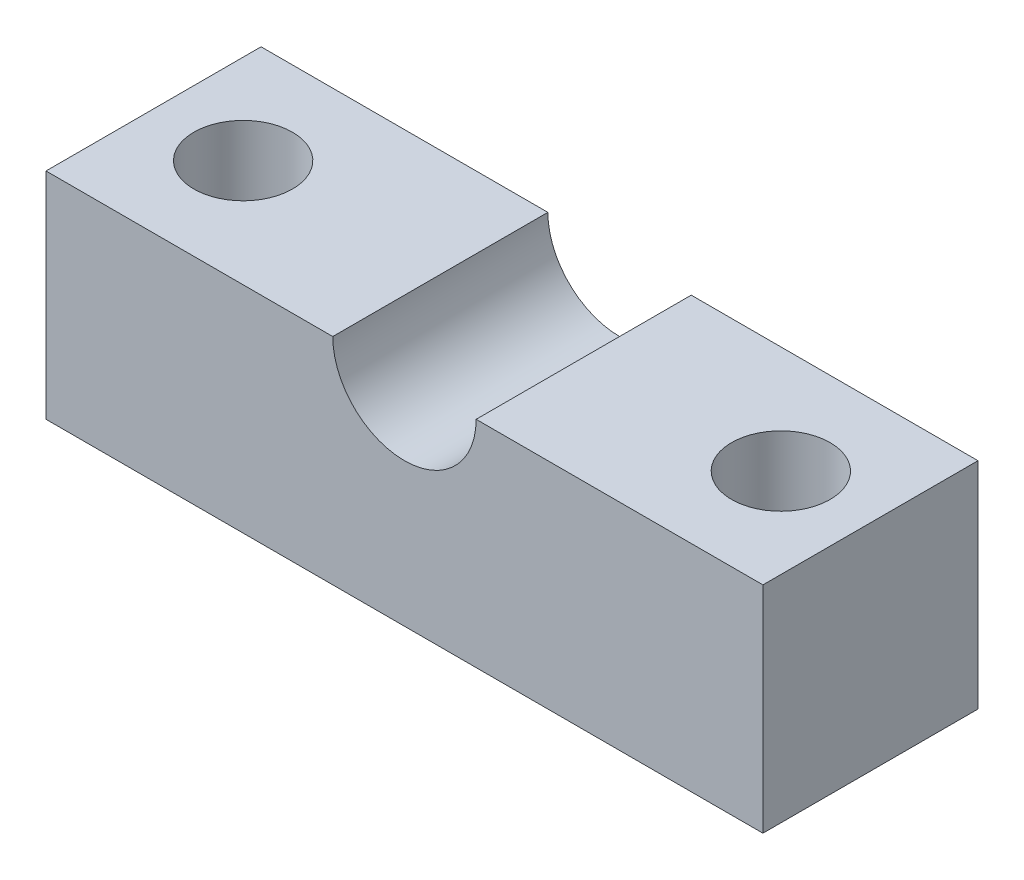
ISO-10303-21;
HEADER;
FILE_DESCRIPTION(('STEP AP214'),'2;1');
FILE_NAME('part.step','',(''),(''),'','','');
FILE_SCHEMA(('AUTOMOTIVE_DESIGN { 1 0 10303 214 1 1 1 1 }'));
ENDSEC;
DATA;
#1=APPLICATION_CONTEXT('core data for automotive mechanical design processes');
#2=APPLICATION_PROTOCOL_DEFINITION('international standard','automotive_design',2000,#1);
#3=PRODUCT_CONTEXT('',#1,'mechanical');
#4=PRODUCT('Part','Part','',(#3));
#5=PRODUCT_RELATED_PRODUCT_CATEGORY('part','',(#4));
#6=PRODUCT_DEFINITION_FORMATION('','',#4);
#7=PRODUCT_DEFINITION_CONTEXT('part definition',#1,'design');
#8=PRODUCT_DEFINITION('design','',#6,#7);
#9=PRODUCT_DEFINITION_SHAPE('','',#8);
#10=(LENGTH_UNIT() NAMED_UNIT(*) SI_UNIT(.MILLI.,.METRE.));
#11=(NAMED_UNIT(*) PLANE_ANGLE_UNIT() SI_UNIT($,.RADIAN.));
#12=(NAMED_UNIT(*) SI_UNIT($,.STERADIAN.) SOLID_ANGLE_UNIT());
#13=UNCERTAINTY_MEASURE_WITH_UNIT(LENGTH_MEASURE(1.E-05),#10,'distance_accuracy_value','');
#14=(GEOMETRIC_REPRESENTATION_CONTEXT(3) GLOBAL_UNCERTAINTY_ASSIGNED_CONTEXT((#13)) GLOBAL_UNIT_ASSIGNED_CONTEXT((#10,
#11,#12)) REPRESENTATION_CONTEXT('',''));
#15=CARTESIAN_POINT('',(0.,0.,0.));
#16=DIRECTION('',(0.,0.,1.));
#17=DIRECTION('',(1.,0.,0.));
#18=AXIS2_PLACEMENT_3D('',#15,#16,#17);
#19=CARTESIAN_POINT('',(0.,0.,12.));
#20=DIRECTION('',(1.,0.,0.));
#21=DIRECTION('',(0.,0.,-1.));
#22=AXIS2_PLACEMENT_3D('',#19,#20,#21);
#23=PLANE('',#22);
#24=DIRECTION('',(0.,-1.,0.));
#25=VECTOR('',#24,1.);
#26=CARTESIAN_POINT('',(0.,0.,0.));
#27=LINE('',#26,#25);
#28=CARTESIAN_POINT('',(0.,12.,0.));
#29=VERTEX_POINT('',#28);
#30=CARTESIAN_POINT('',(0.,0.,0.));
#31=VERTEX_POINT('',#30);
#32=EDGE_CURVE('E128',#29,#31,#27,.T.);
#33=ORIENTED_EDGE('',*,*,#32,.T.);
#34=DIRECTION('',(0.,0.,-1.));
#35=VECTOR('',#34,1.);
#36=CARTESIAN_POINT('',(0.,0.,12.));
#37=LINE('',#36,#35);
#38=CARTESIAN_POINT('',(0.,0.,12.));
#39=VERTEX_POINT('',#38);
#40=EDGE_CURVE('E11',#39,#31,#37,.T.);
#41=ORIENTED_EDGE('',*,*,#40,.F.);
#42=DIRECTION('',(0.,-1.,0.));
#43=VECTOR('',#42,1.);
#44=CARTESIAN_POINT('',(0.,0.,12.));
#45=LINE('',#44,#43);
#46=CARTESIAN_POINT('',(0.,12.,12.));
#47=VERTEX_POINT('',#46);
#48=EDGE_CURVE('E145',#47,#39,#45,.T.);
#49=ORIENTED_EDGE('',*,*,#48,.F.);
#50=DIRECTION('',(0.,0.,-1.));
#51=VECTOR('',#50,1.);
#52=CARTESIAN_POINT('',(0.,12.,12.));
#53=LINE('',#52,#51);
#54=EDGE_CURVE('E124',#47,#29,#53,.T.);
#55=ORIENTED_EDGE('',*,*,#54,.T.);
#56=EDGE_LOOP('',(#33,#41,#49,#55));
#57=FACE_BOUND('',#56,.T.);
#58=ADVANCED_FACE('F39',(#57),#23,.F.);
#59=CARTESIAN_POINT('',(0.,0.,12.));
#60=DIRECTION('',(0.,1.,0.));
#61=DIRECTION('',(0.,0.,1.));
#62=AXIS2_PLACEMENT_3D('',#59,#60,#61);
#63=PLANE('',#62);
#64=CARTESIAN_POINT('',(5.,0.,6.));
#65=DIRECTION('',(0.,-1.,0.));
#66=DIRECTION('',(0.,0.,-1.));
#67=AXIS2_PLACEMENT_3D('',#64,#65,#66);
#68=CIRCLE('',#67,2.74999999999999);
#69=CARTESIAN_POINT('',(5.,0.,3.25000000000001));
#70=VERTEX_POINT('',#69);
#71=EDGE_CURVE('E209',#70,#70,#68,.T.);
#72=ORIENTED_EDGE('',*,*,#71,.F.);
#73=EDGE_LOOP('',(#72));
#74=FACE_BOUND('',#73,.T.);
#75=CARTESIAN_POINT('',(35.,0.,6.));
#76=DIRECTION('',(0.,-1.,0.));
#77=DIRECTION('',(0.,0.,-1.));
#78=AXIS2_PLACEMENT_3D('',#75,#76,#77);
#79=CIRCLE('',#78,2.74999999999999);
#80=CARTESIAN_POINT('',(35.,0.,3.25000000000001));
#81=VERTEX_POINT('',#80);
#82=EDGE_CURVE('E195',#81,#81,#79,.T.);
#83=ORIENTED_EDGE('',*,*,#82,.F.);
#84=EDGE_LOOP('',(#83));
#85=FACE_BOUND('',#84,.T.);
#86=DIRECTION('',(1.,0.,0.));
#87=VECTOR('',#86,1.);
#88=CARTESIAN_POINT('',(0.,0.,0.));
#89=LINE('',#88,#87);
#90=CARTESIAN_POINT('',(40.,0.,0.));
#91=VERTEX_POINT('',#90);
#92=EDGE_CURVE('E132',#31,#91,#89,.T.);
#93=ORIENTED_EDGE('',*,*,#92,.T.);
#94=DIRECTION('',(0.,0.,-1.));
#95=VECTOR('',#94,1.);
#96=CARTESIAN_POINT('',(40.,0.,12.));
#97=LINE('',#96,#95);
#98=CARTESIAN_POINT('',(40.,0.,12.));
#99=VERTEX_POINT('',#98);
#100=EDGE_CURVE('E48',#99,#91,#97,.T.);
#101=ORIENTED_EDGE('',*,*,#100,.F.);
#102=DIRECTION('',(1.,0.,0.));
#103=VECTOR('',#102,1.);
#104=CARTESIAN_POINT('',(0.,0.,12.));
#105=LINE('',#104,#103);
#106=EDGE_CURVE('E93',#39,#99,#105,.T.);
#107=ORIENTED_EDGE('',*,*,#106,.F.);
#108=ORIENTED_EDGE('',*,*,#40,.T.);
#109=EDGE_LOOP('',(#93,#101,#107,#108));
#110=FACE_BOUND('',#109,.T.);
#111=ADVANCED_FACE('F175',(#74,#85,#110),#63,.F.);
#112=CARTESIAN_POINT('',(40.,0.,12.));
#113=DIRECTION('',(-1.,0.,0.));
#114=DIRECTION('',(0.,0.,1.));
#115=AXIS2_PLACEMENT_3D('',#112,#113,#114);
#116=PLANE('',#115);
#117=DIRECTION('',(0.,1.,0.));
#118=VECTOR('',#117,1.);
#119=CARTESIAN_POINT('',(40.,0.,0.));
#120=LINE('',#119,#118);
#121=CARTESIAN_POINT('',(40.,12.,0.));
#122=VERTEX_POINT('',#121);
#123=EDGE_CURVE('E136',#91,#122,#120,.T.);
#124=ORIENTED_EDGE('',*,*,#123,.T.);
#125=DIRECTION('',(0.,0.,-1.));
#126=VECTOR('',#125,1.);
#127=CARTESIAN_POINT('',(40.,12.,12.));
#128=LINE('',#127,#126);
#129=CARTESIAN_POINT('',(40.,12.,12.));
#130=VERTEX_POINT('',#129);
#131=EDGE_CURVE('E117',#130,#122,#128,.T.);
#132=ORIENTED_EDGE('',*,*,#131,.F.);
#133=DIRECTION('',(0.,1.,0.));
#134=VECTOR('',#133,1.);
#135=CARTESIAN_POINT('',(40.,0.,12.));
#136=LINE('',#135,#134);
#137=EDGE_CURVE('E106',#99,#130,#136,.T.);
#138=ORIENTED_EDGE('',*,*,#137,.F.);
#139=ORIENTED_EDGE('',*,*,#100,.T.);
#140=EDGE_LOOP('',(#124,#132,#138,#139));
#141=FACE_BOUND('',#140,.T.);
#142=ADVANCED_FACE('F155',(#141),#116,.F.);
#143=CARTESIAN_POINT('',(24.,12.,12.));
#144=DIRECTION('',(0.,-1.,0.));
#145=DIRECTION('',(0.,0.,-1.));
#146=AXIS2_PLACEMENT_3D('',#143,#144,#145);
#147=PLANE('',#146);
#148=CARTESIAN_POINT('',(35.,12.,6.));
#149=DIRECTION('',(0.,-1.,0.));
#150=DIRECTION('',(0.,0.,-1.));
#151=AXIS2_PLACEMENT_3D('',#148,#149,#150);
#152=CIRCLE('',#151,2.75);
#153=CARTESIAN_POINT('',(35.,12.,3.25));
#154=VERTEX_POINT('',#153);
#155=EDGE_CURVE('E133',#154,#154,#152,.T.);
#156=ORIENTED_EDGE('',*,*,#155,.T.);
#157=EDGE_LOOP('',(#156));
#158=FACE_BOUND('',#157,.T.);
#159=DIRECTION('',(-1.,0.,0.));
#160=VECTOR('',#159,1.);
#161=CARTESIAN_POINT('',(24.,12.,0.));
#162=LINE('',#161,#160);
#163=CARTESIAN_POINT('',(24.,12.,0.));
#164=VERTEX_POINT('',#163);
#165=EDGE_CURVE('E115',#122,#164,#162,.T.);
#166=ORIENTED_EDGE('',*,*,#165,.T.);
#167=DIRECTION('',(0.,0.,-1.));
#168=VECTOR('',#167,1.);
#169=CARTESIAN_POINT('',(24.,12.,12.));
#170=LINE('',#169,#168);
#171=CARTESIAN_POINT('',(24.,12.,12.));
#172=VERTEX_POINT('',#171);
#173=EDGE_CURVE('E112',#172,#164,#170,.T.);
#174=ORIENTED_EDGE('',*,*,#173,.F.);
#175=DIRECTION('',(-1.,0.,0.));
#176=VECTOR('',#175,1.);
#177=CARTESIAN_POINT('',(24.,12.,12.));
#178=LINE('',#177,#176);
#179=EDGE_CURVE('E100',#130,#172,#178,.T.);
#180=ORIENTED_EDGE('',*,*,#179,.F.);
#181=ORIENTED_EDGE('',*,*,#131,.T.);
#182=EDGE_LOOP('',(#166,#174,#180,#181));
#183=FACE_BOUND('',#182,.T.);
#184=ADVANCED_FACE('F113',(#158,#183),#147,.F.);
#185=CARTESIAN_POINT('',(20.,12.,12.));
#186=DIRECTION('',(0.,0.,-1.));
#187=DIRECTION('',(-1.,0.,0.));
#188=AXIS2_PLACEMENT_3D('',#185,#186,#187);
#189=CYLINDRICAL_SURFACE('',#188,4.);
#190=CARTESIAN_POINT('',(20.,12.,0.));
#191=DIRECTION('',(0.,0.,-1.));
#192=DIRECTION('',(1.,0.,0.));
#193=AXIS2_PLACEMENT_3D('',#190,#191,#192);
#194=CIRCLE('',#193,4.);
#195=CARTESIAN_POINT('',(16.,12.,0.));
#196=VERTEX_POINT('',#195);
#197=EDGE_CURVE('E79',#164,#196,#194,.T.);
#198=ORIENTED_EDGE('',*,*,#197,.T.);
#199=DIRECTION('',(0.,0.,-1.));
#200=VECTOR('',#199,1.);
#201=CARTESIAN_POINT('',(16.,12.,12.));
#202=LINE('',#201,#200);
#203=CARTESIAN_POINT('',(16.,12.,12.));
#204=VERTEX_POINT('',#203);
#205=EDGE_CURVE('E118',#204,#196,#202,.T.);
#206=ORIENTED_EDGE('',*,*,#205,.F.);
#207=CARTESIAN_POINT('',(20.,12.,12.));
#208=DIRECTION('',(0.,0.,-1.));
#209=DIRECTION('',(1.,0.,0.));
#210=AXIS2_PLACEMENT_3D('',#207,#208,#209);
#211=CIRCLE('',#210,4.);
#212=EDGE_CURVE('E104',#172,#204,#211,.T.);
#213=ORIENTED_EDGE('',*,*,#212,.F.);
#214=ORIENTED_EDGE('',*,*,#173,.T.);
#215=EDGE_LOOP('',(#198,#206,#213,#214));
#216=FACE_BOUND('',#215,.T.);
#217=ADVANCED_FACE('F120',(#216),#189,.F.);
#218=CARTESIAN_POINT('',(0.,12.,12.));
#219=DIRECTION('',(0.,-1.,0.));
#220=DIRECTION('',(0.,0.,-1.));
#221=AXIS2_PLACEMENT_3D('',#218,#219,#220);
#222=PLANE('',#221);
#223=CARTESIAN_POINT('',(5.,12.,6.));
#224=DIRECTION('',(0.,-1.,0.));
#225=DIRECTION('',(0.,0.,-1.));
#226=AXIS2_PLACEMENT_3D('',#223,#224,#225);
#227=CIRCLE('',#226,2.75);
#228=CARTESIAN_POINT('',(5.,12.,3.25));
#229=VERTEX_POINT('',#228);
#230=EDGE_CURVE('E199',#229,#229,#227,.T.);
#231=ORIENTED_EDGE('',*,*,#230,.T.);
#232=EDGE_LOOP('',(#231));
#233=FACE_BOUND('',#232,.T.);
#234=DIRECTION('',(-1.,0.,0.));
#235=VECTOR('',#234,1.);
#236=CARTESIAN_POINT('',(0.,12.,0.));
#237=LINE('',#236,#235);
#238=EDGE_CURVE('E85',#196,#29,#237,.T.);
#239=ORIENTED_EDGE('',*,*,#238,.T.);
#240=ORIENTED_EDGE('',*,*,#54,.F.);
#241=DIRECTION('',(-1.,0.,0.));
#242=VECTOR('',#241,1.);
#243=CARTESIAN_POINT('',(0.,12.,12.));
#244=LINE('',#243,#242);
#245=EDGE_CURVE('E56',#204,#47,#244,.T.);
#246=ORIENTED_EDGE('',*,*,#245,.F.);
#247=ORIENTED_EDGE('',*,*,#205,.T.);
#248=EDGE_LOOP('',(#239,#240,#246,#247));
#249=FACE_BOUND('',#248,.T.);
#250=ADVANCED_FACE('F162',(#233,#249),#222,.F.);
#251=CARTESIAN_POINT('',(20.,12.,12.));
#252=DIRECTION('',(0.,0.,1.));
#253=DIRECTION('',(1.,0.,0.));
#254=AXIS2_PLACEMENT_3D('',#251,#252,#253);
#255=PLANE('',#254);
#256=ORIENTED_EDGE('',*,*,#48,.T.);
#257=ORIENTED_EDGE('',*,*,#106,.T.);
#258=ORIENTED_EDGE('',*,*,#137,.T.);
#259=ORIENTED_EDGE('',*,*,#179,.T.);
#260=ORIENTED_EDGE('',*,*,#212,.T.);
#261=ORIENTED_EDGE('',*,*,#245,.T.);
#262=EDGE_LOOP('',(#256,#257,#258,#259,#260,#261));
#263=FACE_BOUND('',#262,.T.);
#264=ADVANCED_FACE('F102',(#263),#255,.T.);
#265=CARTESIAN_POINT('',(20.,12.,0.));
#266=DIRECTION('',(0.,0.,1.));
#267=DIRECTION('',(1.,0.,0.));
#268=AXIS2_PLACEMENT_3D('',#265,#266,#267);
#269=PLANE('',#268);
#270=ORIENTED_EDGE('',*,*,#32,.F.);
#271=ORIENTED_EDGE('',*,*,#238,.F.);
#272=ORIENTED_EDGE('',*,*,#197,.F.);
#273=ORIENTED_EDGE('',*,*,#165,.F.);
#274=ORIENTED_EDGE('',*,*,#123,.F.);
#275=ORIENTED_EDGE('',*,*,#92,.F.);
#276=EDGE_LOOP('',(#270,#271,#272,#273,#274,#275));
#277=FACE_BOUND('',#276,.T.);
#278=ADVANCED_FACE('F158',(#277),#269,.F.);
#279=CARTESIAN_POINT('',(35.,0.,6.));
#280=DIRECTION('',(0.,-1.,0.));
#281=DIRECTION('',(0.,0.,-1.));
#282=AXIS2_PLACEMENT_3D('',#279,#280,#281);
#283=CYLINDRICAL_SURFACE('',#282,2.74999999999999);
#284=ORIENTED_EDGE('',*,*,#155,.F.);
#285=EDGE_LOOP('',(#284));
#286=FACE_BOUND('',#285,.T.);
#287=ORIENTED_EDGE('',*,*,#82,.T.);
#288=EDGE_LOOP('',(#287));
#289=FACE_BOUND('',#288,.T.);
#290=ADVANCED_FACE('F215',(#286,#289),#283,.F.);
#291=CARTESIAN_POINT('',(5.,0.,6.));
#292=DIRECTION('',(0.,-1.,0.));
#293=DIRECTION('',(0.,0.,-1.));
#294=AXIS2_PLACEMENT_3D('',#291,#292,#293);
#295=CYLINDRICAL_SURFACE('',#294,2.74999999999999);
#296=ORIENTED_EDGE('',*,*,#230,.F.);
#297=EDGE_LOOP('',(#296));
#298=FACE_BOUND('',#297,.T.);
#299=ORIENTED_EDGE('',*,*,#71,.T.);
#300=EDGE_LOOP('',(#299));
#301=FACE_BOUND('',#300,.T.);
#302=ADVANCED_FACE('F213',(#298,#301),#295,.F.);
#303=CLOSED_SHELL('',(#58,#111,#142,#184,#217,#250,#264,#278,#290,#302));
#304=MANIFOLD_SOLID_BREP('B2',#303);
#305=ADVANCED_BREP_SHAPE_REPRESENTATION('',(#18,#304),#14);
#306=SHAPE_DEFINITION_REPRESENTATION(#9,#305);
ENDSEC;
END-ISO-10303-21;
